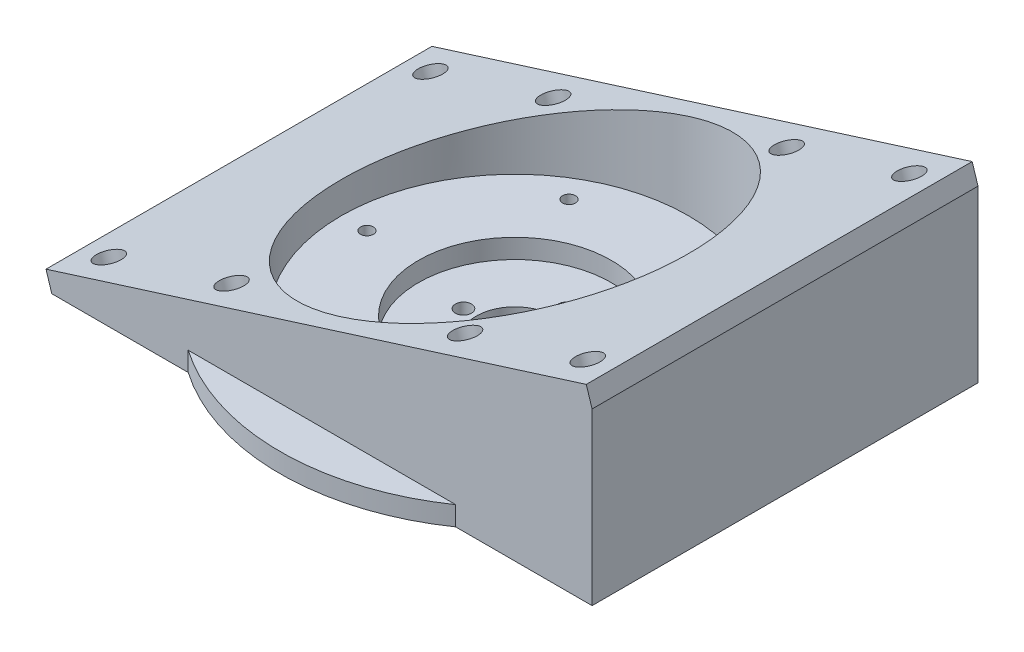
ISO-10303-21;
HEADER;
FILE_DESCRIPTION(('STEP AP214'),'2;1');
FILE_NAME('part.step','',(''),(''),'','','');
FILE_SCHEMA(('AUTOMOTIVE_DESIGN { 1 0 10303 214 1 1 1 1 }'));
ENDSEC;
DATA;
#1=APPLICATION_CONTEXT('core data for automotive mechanical design processes');
#2=APPLICATION_PROTOCOL_DEFINITION('international standard','automotive_design',2000,#1);
#3=PRODUCT_CONTEXT('',#1,'mechanical');
#4=PRODUCT('Part','Part','',(#3));
#5=PRODUCT_RELATED_PRODUCT_CATEGORY('part','',(#4));
#6=PRODUCT_DEFINITION_FORMATION('','',#4);
#7=PRODUCT_DEFINITION_CONTEXT('part definition',#1,'design');
#8=PRODUCT_DEFINITION('design','',#6,#7);
#9=PRODUCT_DEFINITION_SHAPE('','',#8);
#10=(LENGTH_UNIT() NAMED_UNIT(*) SI_UNIT(.MILLI.,.METRE.));
#11=(NAMED_UNIT(*) PLANE_ANGLE_UNIT() SI_UNIT($,.RADIAN.));
#12=(NAMED_UNIT(*) SI_UNIT($,.STERADIAN.) SOLID_ANGLE_UNIT());
#13=UNCERTAINTY_MEASURE_WITH_UNIT(LENGTH_MEASURE(1.E-05),#10,'distance_accuracy_value','');
#14=(GEOMETRIC_REPRESENTATION_CONTEXT(3) GLOBAL_UNCERTAINTY_ASSIGNED_CONTEXT((#13)) GLOBAL_UNIT_ASSIGNED_CONTEXT((#10,
#11,#12)) REPRESENTATION_CONTEXT('',''));
#15=CARTESIAN_POINT('',(0.,0.,0.));
#16=DIRECTION('',(0.,0.,1.));
#17=DIRECTION('',(1.,0.,0.));
#18=AXIS2_PLACEMENT_3D('',#15,#16,#17);
#19=CARTESIAN_POINT('',(-25.0823798627002,-10.9576659038902,30.));
#20=DIRECTION('',(0.,1.,0.));
#21=DIRECTION('',(0.,0.,1.));
#22=AXIS2_PLACEMENT_3D('',#19,#20,#21);
#23=CYLINDRICAL_SURFACE('',#22,6.);
#24=CARTESIAN_POINT('',(-25.0823798627002,-10.9576659038902,30.));
#25=DIRECTION('',(0.,1.,0.));
#26=DIRECTION('',(0.,0.,1.));
#27=AXIS2_PLACEMENT_3D('',#24,#25,#26);
#28=CIRCLE('',#27,6.);
#29=CARTESIAN_POINT('',(-25.0823798627002,-10.9576659038902,36.));
#30=VERTEX_POINT('',#29);
#31=EDGE_CURVE('E412',#30,#30,#28,.T.);
#32=ORIENTED_EDGE('',*,*,#31,.F.);
#33=EDGE_LOOP('',(#32));
#34=FACE_BOUND('',#33,.T.);
#35=CARTESIAN_POINT('',(-25.0823798627002,-7.95766590389017,30.));
#36=DIRECTION('',(0.,1.,0.));
#37=DIRECTION('',(0.,0.,1.));
#38=AXIS2_PLACEMENT_3D('',#35,#36,#37);
#39=CIRCLE('',#38,6.);
#40=CARTESIAN_POINT('',(-25.0823798627002,-7.95766590389017,36.));
#41=VERTEX_POINT('',#40);
#42=EDGE_CURVE('E43',#41,#41,#39,.F.);
#43=ORIENTED_EDGE('',*,*,#42,.F.);
#44=EDGE_LOOP('',(#43));
#45=FACE_BOUND('',#44,.T.);
#46=ADVANCED_FACE('F39',(#34,#45),#23,.F.);
#47=CARTESIAN_POINT('',(-25.0823798627002,42.0423340961098,30.));
#48=DIRECTION('',(0.,-1.,0.));
#49=DIRECTION('',(0.,0.,-1.));
#50=AXIS2_PLACEMENT_3D('',#47,#48,#49);
#51=CYLINDRICAL_SURFACE('',#50,27.);
#52=CARTESIAN_POINT('',(-25.0823798627002,8.4304706044496,30.));
#53=DIRECTION('',(-0.300705799504274,0.953716950748227,0.));
#54=DIRECTION('',(-0.953716950748227,-0.300705799504274,0.));
#55=AXIS2_PLACEMENT_3D('',#52,#53,#54);
#56=ELLIPSE('',#55,28.3102863788019,27.);
#57=CARTESIAN_POINT('',(-52.0823798627002,-0.0825966952829708,30.));
#58=VERTEX_POINT('',#57);
#59=EDGE_CURVE('E140',#58,#58,#56,.T.);
#60=ORIENTED_EDGE('',*,*,#59,.T.);
#61=EDGE_LOOP('',(#60));
#62=FACE_BOUND('',#61,.T.);
#63=CARTESIAN_POINT('',(-25.0823798627002,-4.95766590389017,30.));
#64=DIRECTION('',(0.,-1.,0.));
#65=DIRECTION('',(0.,0.,-1.));
#66=AXIS2_PLACEMENT_3D('',#63,#64,#65);
#67=CIRCLE('',#66,27.);
#68=CARTESIAN_POINT('',(-25.0823798627002,-4.95766590389017,3.));
#69=VERTEX_POINT('',#68);
#70=EDGE_CURVE('E174',#69,#69,#67,.F.);
#71=ORIENTED_EDGE('',*,*,#70,.F.);
#72=EDGE_LOOP('',(#71));
#73=FACE_BOUND('',#72,.T.);
#74=ADVANCED_FACE('F208',(#62,#73),#51,.F.);
#75=CARTESIAN_POINT('',(-67.0823798627002,-7.95766590389017,60.));
#76=DIRECTION('',(0.,1.,0.));
#77=DIRECTION('',(0.,0.,1.));
#78=AXIS2_PLACEMENT_3D('',#75,#76,#77);
#79=PLANE('',#78);
#80=CARTESIAN_POINT('',(-36.5823798627005,-7.95766590389017,10.081415712958));
#81=DIRECTION('',(0.,1.,0.));
#82=DIRECTION('',(0.,0.,1.));
#83=AXIS2_PLACEMENT_3D('',#80,#81,#82);
#84=CIRCLE('',#83,0.999999999999998);
#85=CARTESIAN_POINT('',(-36.5823798627005,-7.95766590389017,11.081415712958));
#86=VERTEX_POINT('',#85);
#87=EDGE_CURVE('E326',#86,#86,#84,.T.);
#88=ORIENTED_EDGE('',*,*,#87,.T.);
#89=EDGE_LOOP('',(#88));
#90=FACE_BOUND('',#89,.T.);
#91=CARTESIAN_POINT('',(-13.5823798627004,-7.95766590389017,10.0814157129578));
#92=DIRECTION('',(0.,1.,0.));
#93=DIRECTION('',(0.,0.,1.));
#94=AXIS2_PLACEMENT_3D('',#91,#92,#93);
#95=CIRCLE('',#94,0.999999999999998);
#96=CARTESIAN_POINT('',(-13.5823798627004,-7.95766590389017,11.0814157129578));
#97=VERTEX_POINT('',#96);
#98=EDGE_CURVE('E331',#97,#97,#95,.T.);
#99=ORIENTED_EDGE('',*,*,#98,.T.);
#100=EDGE_LOOP('',(#99));
#101=FACE_BOUND('',#100,.T.);
#102=CARTESIAN_POINT('',(-2.08237986270024,-7.95766590389017,30.));
#103=DIRECTION('',(0.,1.,0.));
#104=DIRECTION('',(0.,0.,1.));
#105=AXIS2_PLACEMENT_3D('',#102,#103,#104);
#106=CIRCLE('',#105,0.999999999999998);
#107=CARTESIAN_POINT('',(-2.08237986270024,-7.95766590389017,31.));
#108=VERTEX_POINT('',#107);
#109=EDGE_CURVE('E334',#108,#108,#106,.T.);
#110=ORIENTED_EDGE('',*,*,#109,.T.);
#111=EDGE_LOOP('',(#110));
#112=FACE_BOUND('',#111,.T.);
#113=CARTESIAN_POINT('',(-13.5823798627001,-7.95766590389017,49.918584287042));
#114=DIRECTION('',(0.,1.,0.));
#115=DIRECTION('',(0.,0.,1.));
#116=AXIS2_PLACEMENT_3D('',#113,#114,#115);
#117=CIRCLE('',#116,0.999999999999998);
#118=CARTESIAN_POINT('',(-13.5823798627001,-7.95766590389017,50.918584287042));
#119=VERTEX_POINT('',#118);
#120=EDGE_CURVE('E337',#119,#119,#117,.T.);
#121=ORIENTED_EDGE('',*,*,#120,.T.);
#122=EDGE_LOOP('',(#121));
#123=FACE_BOUND('',#122,.T.);
#124=CARTESIAN_POINT('',(-36.5823798627002,-7.95766590389017,49.9185842870421));
#125=DIRECTION('',(0.,1.,0.));
#126=DIRECTION('',(0.,0.,1.));
#127=AXIS2_PLACEMENT_3D('',#124,#125,#126);
#128=CIRCLE('',#127,0.999999999999998);
#129=CARTESIAN_POINT('',(-36.5823798627002,-7.95766590389017,50.9185842870421));
#130=VERTEX_POINT('',#129);
#131=EDGE_CURVE('E340',#130,#130,#128,.T.);
#132=ORIENTED_EDGE('',*,*,#131,.T.);
#133=EDGE_LOOP('',(#132));
#134=FACE_BOUND('',#133,.T.);
#135=CARTESIAN_POINT('',(-48.0823798627002,-7.95766590389017,30.));
#136=DIRECTION('',(0.,1.,0.));
#137=DIRECTION('',(0.,0.,1.));
#138=AXIS2_PLACEMENT_3D('',#135,#136,#137);
#139=CIRCLE('',#138,0.999999999999998);
#140=CARTESIAN_POINT('',(-48.0823798627002,-7.95766590389017,31.));
#141=VERTEX_POINT('',#140);
#142=EDGE_CURVE('E133',#141,#141,#139,.T.);
#143=ORIENTED_EDGE('',*,*,#142,.T.);
#144=EDGE_LOOP('',(#143));
#145=FACE_BOUND('',#144,.T.);
#146=CARTESIAN_POINT('',(-25.0823798627002,-7.95766590389017,30.));
#147=DIRECTION('',(0.,1.,0.));
#148=DIRECTION('',(0.,0.,1.));
#149=AXIS2_PLACEMENT_3D('',#146,#147,#148);
#150=CIRCLE('',#149,20.);
#151=CARTESIAN_POINT('',(-25.0823798627002,-7.95766590389017,50.));
#152=VERTEX_POINT('',#151);
#153=EDGE_CURVE('E399',#152,#152,#150,.T.);
#154=ORIENTED_EDGE('',*,*,#153,.T.);
#155=EDGE_LOOP('',(#154));
#156=FACE_BOUND('',#155,.T.);
#157=DIRECTION('',(1.,0.,0.));
#158=VECTOR('',#157,1.);
#159=CARTESIAN_POINT('',(-67.0823798627002,-7.95766590389017,0.));
#160=LINE('',#159,#158);
#161=CARTESIAN_POINT('',(-67.0823798627002,-7.95766590389017,0.));
#162=VERTEX_POINT('',#161);
#163=CARTESIAN_POINT('',(-45.873002748992,-7.95766590389017,0.));
#164=VERTEX_POINT('',#163);
#165=EDGE_CURVE('E166',#162,#164,#160,.T.);
#166=ORIENTED_EDGE('',*,*,#165,.T.);
#167=CARTESIAN_POINT('',(-25.0823798627002,-7.95766590389017,30.));
#168=DIRECTION('',(0.,-1.,0.));
#169=DIRECTION('',(0.,0.,-1.));
#170=AXIS2_PLACEMENT_3D('',#167,#168,#169);
#171=CIRCLE('',#170,36.5);
#172=CARTESIAN_POINT('',(-4.29175697640848,-7.95766590389017,0.));
#173=VERTEX_POINT('',#172);
#174=EDGE_CURVE('E128',#164,#173,#171,.T.);
#175=ORIENTED_EDGE('',*,*,#174,.T.);
#176=CARTESIAN_POINT('',(16.9176201372998,-7.95766590389017,0.));
#177=VERTEX_POINT('',#176);
#178=EDGE_CURVE('E161',#173,#177,#160,.T.);
#179=ORIENTED_EDGE('',*,*,#178,.T.);
#180=DIRECTION('',(0.,0.,-1.));
#181=VECTOR('',#180,1.);
#182=CARTESIAN_POINT('',(16.9176201372998,-7.95766590389017,60.));
#183=LINE('',#182,#181);
#184=CARTESIAN_POINT('',(16.9176201372998,-7.95766590389017,60.));
#185=VERTEX_POINT('',#184);
#186=EDGE_CURVE('E115',#185,#177,#183,.T.);
#187=ORIENTED_EDGE('',*,*,#186,.F.);
#188=DIRECTION('',(1.,0.,0.));
#189=VECTOR('',#188,1.);
#190=CARTESIAN_POINT('',(-67.0823798627002,-7.95766590389017,60.));
#191=LINE('',#190,#189);
#192=CARTESIAN_POINT('',(-4.29175697640845,-7.95766590389017,60.));
#193=VERTEX_POINT('',#192);
#194=EDGE_CURVE('E110',#193,#185,#191,.T.);
#195=ORIENTED_EDGE('',*,*,#194,.F.);
#196=CARTESIAN_POINT('',(-45.873002748992,-7.95766590389017,60.));
#197=VERTEX_POINT('',#196);
#198=EDGE_CURVE('E113',#193,#197,#171,.T.);
#199=ORIENTED_EDGE('',*,*,#198,.T.);
#200=CARTESIAN_POINT('',(-67.0823798627002,-7.95766590389017,60.));
#201=VERTEX_POINT('',#200);
#202=EDGE_CURVE('E117',#201,#197,#191,.T.);
#203=ORIENTED_EDGE('',*,*,#202,.F.);
#204=DIRECTION('',(0.,0.,-1.));
#205=VECTOR('',#204,1.);
#206=CARTESIAN_POINT('',(-67.0823798627002,-7.95766590389017,60.));
#207=LINE('',#206,#205);
#208=EDGE_CURVE('E172',#201,#162,#207,.T.);
#209=ORIENTED_EDGE('',*,*,#208,.T.);
#210=EDGE_LOOP('',(#166,#175,#179,#187,#195,#199,#203,#209));
#211=FACE_BOUND('',#210,.T.);
#212=ADVANCED_FACE('F41',(#90,#101,#112,#123,#134,#145,#156,#211),#79,.F.);
#213=CARTESIAN_POINT('',(16.9176201372998,-7.95766590389017,60.));
#214=DIRECTION('',(-1.,0.,0.));
#215=DIRECTION('',(0.,0.,1.));
#216=AXIS2_PLACEMENT_3D('',#213,#214,#215);
#217=PLANE('',#216);
#218=DIRECTION('',(0.,1.,0.));
#219=VECTOR('',#218,1.);
#220=CARTESIAN_POINT('',(16.9176201372998,-7.95766590389017,0.));
#221=LINE('',#220,#219);
#222=CARTESIAN_POINT('',(16.9176201372998,18.5274323619445,0.));
#223=VERTEX_POINT('',#222);
#224=EDGE_CURVE('E118',#177,#223,#221,.T.);
#225=ORIENTED_EDGE('',*,*,#224,.T.);
#226=DIRECTION('',(0.,0.,-1.));
#227=VECTOR('',#226,1.);
#228=CARTESIAN_POINT('',(16.9176201372998,18.5274323619445,60.));
#229=LINE('',#228,#227);
#230=CARTESIAN_POINT('',(16.9176201372998,18.5274323619445,60.));
#231=VERTEX_POINT('',#230);
#232=EDGE_CURVE('E165',#231,#223,#229,.T.);
#233=ORIENTED_EDGE('',*,*,#232,.F.);
#234=DIRECTION('',(0.,1.,0.));
#235=VECTOR('',#234,1.);
#236=CARTESIAN_POINT('',(16.9176201372998,-7.95766590389017,60.));
#237=LINE('',#236,#235);
#238=EDGE_CURVE('E163',#185,#231,#237,.T.);
#239=ORIENTED_EDGE('',*,*,#238,.F.);
#240=ORIENTED_EDGE('',*,*,#186,.T.);
#241=EDGE_LOOP('',(#225,#233,#239,#240));
#242=FACE_BOUND('',#241,.T.);
#243=ADVANCED_FACE('F488',(#242),#217,.F.);
#244=CARTESIAN_POINT('',(0.,0.,60.));
#245=DIRECTION('',(0.,0.,1.));
#246=DIRECTION('',(1.,0.,0.));
#247=AXIS2_PLACEMENT_3D('',#244,#245,#246);
#248=PLANE('',#247);
#249=DIRECTION('',(0.,-1.,0.));
#250=VECTOR('',#249,1.);
#251=CARTESIAN_POINT('',(-45.873002748992,-4.95766590389017,60.));
#252=LINE('',#251,#250);
#253=CARTESIAN_POINT('',(-45.873002748992,-4.95766590389017,60.));
#254=VERTEX_POINT('',#253);
#255=EDGE_CURVE('E60',#254,#197,#252,.T.);
#256=ORIENTED_EDGE('',*,*,#255,.F.);
#257=DIRECTION('',(1.,0.,0.));
#258=VECTOR('',#257,1.);
#259=CARTESIAN_POINT('',(0.,-4.95766590389017,60.));
#260=LINE('',#259,#258);
#261=CARTESIAN_POINT('',(-4.29175697640845,-4.95766590389017,60.));
#262=VERTEX_POINT('',#261);
#263=EDGE_CURVE('E55',#254,#262,#260,.T.);
#264=ORIENTED_EDGE('',*,*,#263,.T.);
#265=DIRECTION('',(0.,-1.,0.));
#266=VECTOR('',#265,1.);
#267=CARTESIAN_POINT('',(-4.29175697640845,-4.95766590389017,60.));
#268=LINE('',#267,#266);
#269=EDGE_CURVE('E120',#193,#262,#268,.F.);
#270=ORIENTED_EDGE('',*,*,#269,.F.);
#271=ORIENTED_EDGE('',*,*,#194,.T.);
#272=ORIENTED_EDGE('',*,*,#238,.T.);
#273=DIRECTION('',(0.300705799504274,-0.953716950748227,0.));
#274=VECTOR('',#273,1.);
#275=CARTESIAN_POINT('',(16.0155027387869,21.3885832141892,60.));
#276=LINE('',#275,#274);
#277=CARTESIAN_POINT('',(16.0155027387869,21.3885832141892,60.));
#278=VERTEX_POINT('',#277);
#279=EDGE_CURVE('E156',#278,#231,#276,.T.);
#280=ORIENTED_EDGE('',*,*,#279,.F.);
#281=DIRECTION('',(0.953716950748227,0.300705799504274,0.));
#282=VECTOR('',#281,1.);
#283=CARTESIAN_POINT('',(-67.9844972612131,-5.09651505164549,60.));
#284=LINE('',#283,#282);
#285=CARTESIAN_POINT('',(-67.9844972612131,-5.09651505164549,60.));
#286=VERTEX_POINT('',#285);
#287=EDGE_CURVE('E144',#286,#278,#284,.T.);
#288=ORIENTED_EDGE('',*,*,#287,.F.);
#289=DIRECTION('',(0.300705799504274,-0.953716950748227,0.));
#290=VECTOR('',#289,1.);
#291=CARTESIAN_POINT('',(-67.9844972612131,-5.09651505164549,60.));
#292=LINE('',#291,#290);
#293=EDGE_CURVE('E159',#286,#201,#292,.T.);
#294=ORIENTED_EDGE('',*,*,#293,.T.);
#295=ORIENTED_EDGE('',*,*,#202,.T.);
#296=EDGE_LOOP('',(#256,#264,#270,#271,#272,#280,#288,#294,#295));
#297=FACE_BOUND('',#296,.T.);
#298=ADVANCED_FACE('F121',(#297),#248,.T.);
#299=CARTESIAN_POINT('',(0.,0.,0.));
#300=DIRECTION('',(0.,0.,1.));
#301=DIRECTION('',(1.,0.,0.));
#302=AXIS2_PLACEMENT_3D('',#299,#300,#301);
#303=PLANE('',#302);
#304=DIRECTION('',(1.,0.,0.));
#305=VECTOR('',#304,1.);
#306=CARTESIAN_POINT('',(0.,-4.95766590389017,0.));
#307=LINE('',#306,#305);
#308=CARTESIAN_POINT('',(-45.873002748992,-4.95766590389017,0.));
#309=VERTEX_POINT('',#308);
#310=CARTESIAN_POINT('',(-4.29175697640845,-4.95766590389017,0.));
#311=VERTEX_POINT('',#310);
#312=EDGE_CURVE('E136',#309,#311,#307,.T.);
#313=ORIENTED_EDGE('',*,*,#312,.F.);
#314=DIRECTION('',(0.,-1.,0.));
#315=VECTOR('',#314,1.);
#316=CARTESIAN_POINT('',(-45.873002748992,-4.95766590389017,0.));
#317=LINE('',#316,#315);
#318=EDGE_CURVE('E11',#309,#164,#317,.T.);
#319=ORIENTED_EDGE('',*,*,#318,.T.);
#320=ORIENTED_EDGE('',*,*,#165,.F.);
#321=DIRECTION('',(0.300705799504274,-0.953716950748227,0.));
#322=VECTOR('',#321,1.);
#323=CARTESIAN_POINT('',(-67.9844972612131,-5.09651505164549,0.));
#324=LINE('',#323,#322);
#325=CARTESIAN_POINT('',(-67.9844972612131,-5.09651505164549,0.));
#326=VERTEX_POINT('',#325);
#327=EDGE_CURVE('E150',#326,#162,#324,.T.);
#328=ORIENTED_EDGE('',*,*,#327,.F.);
#329=DIRECTION('',(-0.953716950748227,-0.300705799504274,0.));
#330=VECTOR('',#329,1.);
#331=CARTESIAN_POINT('',(-67.9844972612131,-5.09651505164549,0.));
#332=LINE('',#331,#330);
#333=CARTESIAN_POINT('',(16.0155027387869,21.3885832141892,0.));
#334=VERTEX_POINT('',#333);
#335=EDGE_CURVE('E148',#334,#326,#332,.T.);
#336=ORIENTED_EDGE('',*,*,#335,.F.);
#337=DIRECTION('',(0.300705799504274,-0.953716950748227,0.));
#338=VECTOR('',#337,1.);
#339=CARTESIAN_POINT('',(16.0155027387869,21.3885832141892,0.));
#340=LINE('',#339,#338);
#341=EDGE_CURVE('E153',#334,#223,#340,.T.);
#342=ORIENTED_EDGE('',*,*,#341,.T.);
#343=ORIENTED_EDGE('',*,*,#224,.F.);
#344=ORIENTED_EDGE('',*,*,#178,.F.);
#345=DIRECTION('',(0.,-1.,0.));
#346=VECTOR('',#345,1.);
#347=CARTESIAN_POINT('',(-4.29175697640845,-4.95766590389017,0.));
#348=LINE('',#347,#346);
#349=EDGE_CURVE('E48',#173,#311,#348,.F.);
#350=ORIENTED_EDGE('',*,*,#349,.T.);
#351=EDGE_LOOP('',(#313,#319,#320,#328,#336,#342,#343,#344,#350));
#352=FACE_BOUND('',#351,.T.);
#353=ADVANCED_FACE('F184',(#352),#303,.F.);
#354=CARTESIAN_POINT('',(-67.9844972612131,-5.09651505164549,0.));
#355=DIRECTION('',(0.953716950748227,0.300705799504274,0.));
#356=DIRECTION('',(-0.300705799504274,0.953716950748227,0.));
#357=AXIS2_PLACEMENT_3D('',#354,#355,#356);
#358=PLANE('',#357);
#359=ORIENTED_EDGE('',*,*,#208,.F.);
#360=ORIENTED_EDGE('',*,*,#293,.F.);
#361=DIRECTION('',(0.,0.,1.));
#362=VECTOR('',#361,1.);
#363=CARTESIAN_POINT('',(-67.9844972612131,-5.09651505164549,0.));
#364=LINE('',#363,#362);
#365=EDGE_CURVE('E141',#326,#286,#364,.T.);
#366=ORIENTED_EDGE('',*,*,#365,.F.);
#367=ORIENTED_EDGE('',*,*,#327,.T.);
#368=EDGE_LOOP('',(#359,#360,#366,#367));
#369=FACE_BOUND('',#368,.T.);
#370=ADVANCED_FACE('F514',(#369),#358,.F.);
#371=CARTESIAN_POINT('',(16.0155027387869,21.3885832141892,0.));
#372=DIRECTION('',(-0.953716950748227,-0.300705799504274,0.));
#373=DIRECTION('',(0.300705799504274,-0.953716950748227,0.));
#374=AXIS2_PLACEMENT_3D('',#371,#372,#373);
#375=PLANE('',#374);
#376=ORIENTED_EDGE('',*,*,#232,.T.);
#377=ORIENTED_EDGE('',*,*,#341,.F.);
#378=DIRECTION('',(0.,0.,-1.));
#379=VECTOR('',#378,1.);
#380=CARTESIAN_POINT('',(16.0155027387869,21.3885832141892,0.));
#381=LINE('',#380,#379);
#382=EDGE_CURVE('E146',#278,#334,#381,.T.);
#383=ORIENTED_EDGE('',*,*,#382,.F.);
#384=ORIENTED_EDGE('',*,*,#279,.T.);
#385=EDGE_LOOP('',(#376,#377,#383,#384));
#386=FACE_BOUND('',#385,.T.);
#387=ADVANCED_FACE('F517',(#386),#375,.F.);
#388=CARTESIAN_POINT('',(-4.68580820429939,14.8614849456268,0.));
#389=DIRECTION('',(-0.300705799504274,0.953716950748227,0.));
#390=DIRECTION('',(-0.953716950748227,-0.300705799504274,0.));
#391=AXIS2_PLACEMENT_3D('',#388,#389,#390);
#392=PLANE('',#391);
#393=CARTESIAN_POINT('',(-7.82742102991873,13.8709382265823,55.));
#394=DIRECTION('',(-0.300705799504274,0.953716950748227,0.));
#395=DIRECTION('',(-0.953716950748227,-0.300705799504274,0.));
#396=AXIS2_PLACEMENT_3D('',#393,#394,#395);
#397=CIRCLE('',#396,2.);
#398=CARTESIAN_POINT('',(-9.73485493141519,13.2695266275738,55.));
#399=VERTEX_POINT('',#398);
#400=EDGE_CURVE('E402',#399,#399,#397,.T.);
#401=ORIENTED_EDGE('',*,*,#400,.F.);
#402=EDGE_LOOP('',(#401));
#403=FACE_BOUND('',#402,.T.);
#404=CARTESIAN_POINT('',(-7.82742102991873,13.8709382265823,5.));
#405=DIRECTION('',(-0.300705799504274,0.953716950748227,0.));
#406=DIRECTION('',(-0.953716950748227,-0.300705799504274,0.));
#407=AXIS2_PLACEMENT_3D('',#404,#405,#406);
#408=CIRCLE('',#407,2.);
#409=CARTESIAN_POINT('',(-9.73485493141518,13.2695266275738,5.));
#410=VERTEX_POINT('',#409);
#411=EDGE_CURVE('E395',#410,#410,#408,.T.);
#412=ORIENTED_EDGE('',*,*,#411,.F.);
#413=EDGE_LOOP('',(#412));
#414=FACE_BOUND('',#413,.T.);
#415=CARTESIAN_POINT('',(11.2469179850458,19.8850542166678,55.));
#416=DIRECTION('',(-0.300705799504274,0.953716950748227,0.));
#417=DIRECTION('',(-0.953716950748227,-0.300705799504274,0.));
#418=AXIS2_PLACEMENT_3D('',#415,#416,#417);
#419=CIRCLE('',#418,2.);
#420=CARTESIAN_POINT('',(9.33948408354935,19.2836426176593,55.));
#421=VERTEX_POINT('',#420);
#422=EDGE_CURVE('E390',#421,#421,#419,.T.);
#423=ORIENTED_EDGE('',*,*,#422,.F.);
#424=EDGE_LOOP('',(#423));
#425=FACE_BOUND('',#424,.T.);
#426=CARTESIAN_POINT('',(11.2469179850458,19.8850542166678,5.));
#427=DIRECTION('',(-0.300705799504274,0.953716950748227,0.));
#428=DIRECTION('',(-0.953716950748227,-0.300705799504274,0.));
#429=AXIS2_PLACEMENT_3D('',#426,#427,#428);
#430=CIRCLE('',#429,2.);
#431=CARTESIAN_POINT('',(9.33948408354935,19.2836426176593,5.));
#432=VERTEX_POINT('',#431);
#433=EDGE_CURVE('E386',#432,#432,#430,.T.);
#434=ORIENTED_EDGE('',*,*,#433,.F.);
#435=EDGE_LOOP('',(#434));
#436=FACE_BOUND('',#435,.T.);
#437=CARTESIAN_POINT('',(-44.1415734925074,2.42112993596135,5.));
#438=DIRECTION('',(-0.300705799504274,0.953716950748227,0.));
#439=DIRECTION('',(-0.953716950748227,-0.300705799504274,0.));
#440=AXIS2_PLACEMENT_3D('',#437,#438,#439);
#441=CIRCLE('',#440,2.);
#442=CARTESIAN_POINT('',(-46.0490073940038,1.81971833695281,5.));
#443=VERTEX_POINT('',#442);
#444=EDGE_CURVE('E378',#443,#443,#441,.T.);
#445=ORIENTED_EDGE('',*,*,#444,.F.);
#446=EDGE_LOOP('',(#445));
#447=FACE_BOUND('',#446,.T.);
#448=CARTESIAN_POINT('',(-44.1415734925074,2.42112993596135,55.));
#449=DIRECTION('',(-0.300705799504274,0.953716950748227,0.));
#450=DIRECTION('',(-0.953716950748227,-0.300705799504274,0.));
#451=AXIS2_PLACEMENT_3D('',#448,#449,#450);
#452=CIRCLE('',#451,2.);
#453=CARTESIAN_POINT('',(-46.0490073940039,1.81971833695281,55.));
#454=VERTEX_POINT('',#453);
#455=EDGE_CURVE('E371',#454,#454,#452,.T.);
#456=ORIENTED_EDGE('',*,*,#455,.F.);
#457=EDGE_LOOP('',(#456));
#458=FACE_BOUND('',#457,.T.);
#459=CARTESIAN_POINT('',(-63.2159125074719,-3.59298605412412,5.));
#460=DIRECTION('',(-0.300705799504274,0.953716950748227,0.));
#461=DIRECTION('',(-0.953716950748227,-0.300705799504274,0.));
#462=AXIS2_PLACEMENT_3D('',#459,#460,#461);
#463=CIRCLE('',#462,2.);
#464=CARTESIAN_POINT('',(-65.1233464089684,-4.19439765313267,5.));
#465=VERTEX_POINT('',#464);
#466=EDGE_CURVE('E366',#465,#465,#463,.T.);
#467=ORIENTED_EDGE('',*,*,#466,.F.);
#468=EDGE_LOOP('',(#467));
#469=FACE_BOUND('',#468,.T.);
#470=CARTESIAN_POINT('',(-63.2159125074719,-3.59298605412412,55.));
#471=DIRECTION('',(-0.300705799504274,0.953716950748227,0.));
#472=DIRECTION('',(-0.953716950748227,-0.300705799504274,0.));
#473=AXIS2_PLACEMENT_3D('',#470,#471,#472);
#474=CIRCLE('',#473,2.);
#475=CARTESIAN_POINT('',(-65.1233464089684,-4.19439765313267,55.));
#476=VERTEX_POINT('',#475);
#477=EDGE_CURVE('E362',#476,#476,#474,.T.);
#478=ORIENTED_EDGE('',*,*,#477,.F.);
#479=EDGE_LOOP('',(#478));
#480=FACE_BOUND('',#479,.T.);
#481=ORIENTED_EDGE('',*,*,#59,.F.);
#482=EDGE_LOOP('',(#481));
#483=FACE_BOUND('',#482,.T.);
#484=ORIENTED_EDGE('',*,*,#365,.T.);
#485=ORIENTED_EDGE('',*,*,#287,.T.);
#486=ORIENTED_EDGE('',*,*,#382,.T.);
#487=ORIENTED_EDGE('',*,*,#335,.T.);
#488=EDGE_LOOP('',(#484,#485,#486,#487));
#489=FACE_BOUND('',#488,.T.);
#490=ADVANCED_FACE('F201',(#403,#414,#425,#436,#447,#458,#469,#480,#483,#489),#392,.T.);
#491=CARTESIAN_POINT('',(-25.0823798627002,-4.95766590389017,30.));
#492=DIRECTION('',(0.,-1.,0.));
#493=DIRECTION('',(0.,0.,-1.));
#494=AXIS2_PLACEMENT_3D('',#491,#492,#493);
#495=PLANE('',#494);
#496=CARTESIAN_POINT('',(-25.0823798627002,-4.95766590389017,30.));
#497=DIRECTION('',(0.,1.,0.));
#498=DIRECTION('',(0.,0.,1.));
#499=AXIS2_PLACEMENT_3D('',#496,#497,#498);
#500=CIRCLE('',#499,15.);
#501=CARTESIAN_POINT('',(-25.0823798627002,-4.95766590389017,45.));
#502=VERTEX_POINT('',#501);
#503=EDGE_CURVE('E415',#502,#502,#500,.T.);
#504=ORIENTED_EDGE('',*,*,#503,.F.);
#505=EDGE_LOOP('',(#504));
#506=FACE_BOUND('',#505,.T.);
#507=CARTESIAN_POINT('',(-36.5823798627005,-4.95766590389017,10.081415712958));
#508=DIRECTION('',(0.,1.,0.));
#509=DIRECTION('',(-0.866025403784433,0.,0.50000000000001));
#510=AXIS2_PLACEMENT_3D('',#507,#508,#509);
#511=CIRCLE('',#510,0.999999999999998);
#512=CARTESIAN_POINT('',(-37.4484052664849,-4.95766590389017,10.5814157129581));
#513=VERTEX_POINT('',#512);
#514=EDGE_CURVE('E347',#513,#513,#511,.T.);
#515=ORIENTED_EDGE('',*,*,#514,.F.);
#516=EDGE_LOOP('',(#515));
#517=FACE_BOUND('',#516,.T.);
#518=CARTESIAN_POINT('',(-13.5823798627004,-4.95766590389017,10.0814157129578));
#519=DIRECTION('',(0.,1.,0.));
#520=DIRECTION('',(-0.866025403784443,0.,-0.499999999999992));
#521=AXIS2_PLACEMENT_3D('',#518,#519,#520);
#522=CIRCLE('',#521,0.999999999999998);
#523=CARTESIAN_POINT('',(-14.4484052664849,-4.95766590389017,9.58141571295782));
#524=VERTEX_POINT('',#523);
#525=EDGE_CURVE('E350',#524,#524,#522,.T.);
#526=ORIENTED_EDGE('',*,*,#525,.F.);
#527=EDGE_LOOP('',(#526));
#528=FACE_BOUND('',#527,.T.);
#529=CARTESIAN_POINT('',(-2.08237986270024,-4.95766590389017,30.));
#530=DIRECTION('',(0.,1.,0.));
#531=DIRECTION('',(0.,0.,-1.));
#532=AXIS2_PLACEMENT_3D('',#529,#530,#531);
#533=CIRCLE('',#532,0.999999999999998);
#534=CARTESIAN_POINT('',(-2.08237986270024,-4.95766590389017,29.));
#535=VERTEX_POINT('',#534);
#536=EDGE_CURVE('E354',#535,#535,#533,.T.);
#537=ORIENTED_EDGE('',*,*,#536,.F.);
#538=EDGE_LOOP('',(#537));
#539=FACE_BOUND('',#538,.T.);
#540=CARTESIAN_POINT('',(-13.5823798627001,-4.95766590389017,49.918584287042));
#541=DIRECTION('',(0.,1.,0.));
#542=DIRECTION('',(0.866025403784436,0.,-0.500000000000004));
#543=AXIS2_PLACEMENT_3D('',#540,#541,#542);
#544=CIRCLE('',#543,0.999999999999998);
#545=CARTESIAN_POINT('',(-12.7163544589157,-4.95766590389017,49.418584287042));
#546=VERTEX_POINT('',#545);
#547=EDGE_CURVE('E346',#546,#546,#544,.T.);
#548=ORIENTED_EDGE('',*,*,#547,.F.);
#549=EDGE_LOOP('',(#548));
#550=FACE_BOUND('',#549,.T.);
#551=CARTESIAN_POINT('',(-36.5823798627002,-4.95766590389017,49.9185842870421));
#552=DIRECTION('',(0.,1.,0.));
#553=DIRECTION('',(0.86602540378444,0.,0.499999999999998));
#554=AXIS2_PLACEMENT_3D('',#551,#552,#553);
#555=CIRCLE('',#554,0.999999999999998);
#556=CARTESIAN_POINT('',(-35.7163544589158,-4.95766590389017,50.4185842870421));
#557=VERTEX_POINT('',#556);
#558=EDGE_CURVE('E343',#557,#557,#555,.T.);
#559=ORIENTED_EDGE('',*,*,#558,.F.);
#560=EDGE_LOOP('',(#559));
#561=FACE_BOUND('',#560,.T.);
#562=CARTESIAN_POINT('',(-48.0823798627002,-4.95766590389017,30.));
#563=DIRECTION('',(0.,1.,0.));
#564=DIRECTION('',(0.,0.,1.));
#565=AXIS2_PLACEMENT_3D('',#562,#563,#564);
#566=CIRCLE('',#565,0.999999999999998);
#567=CARTESIAN_POINT('',(-48.0823798627002,-4.95766590389017,31.));
#568=VERTEX_POINT('',#567);
#569=EDGE_CURVE('E322',#568,#568,#566,.T.);
#570=ORIENTED_EDGE('',*,*,#569,.F.);
#571=EDGE_LOOP('',(#570));
#572=FACE_BOUND('',#571,.T.);
#573=ORIENTED_EDGE('',*,*,#70,.T.);
#574=EDGE_LOOP('',(#573));
#575=FACE_BOUND('',#574,.T.);
#576=ADVANCED_FACE('F192',(#506,#517,#528,#539,#550,#561,#572,#575),#495,.F.);
#577=CARTESIAN_POINT('',(-25.0823798627002,-4.95766590389017,30.));
#578=DIRECTION('',(0.,-1.,0.));
#579=DIRECTION('',(0.,0.,-1.));
#580=AXIS2_PLACEMENT_3D('',#577,#578,#579);
#581=CIRCLE('',#580,36.5);
#582=EDGE_CURVE('E127',#309,#311,#581,.T.);
#583=ORIENTED_EDGE('',*,*,#582,.F.);
#584=ORIENTED_EDGE('',*,*,#312,.T.);
#585=EDGE_LOOP('',(#583,#584));
#586=FACE_BOUND('',#585,.T.);
#587=ADVANCED_FACE('F190',(#586),#495,.F.);
#588=CARTESIAN_POINT('',(-25.0823798627002,-4.95766590389017,30.));
#589=DIRECTION('',(0.,-1.,0.));
#590=DIRECTION('',(0.,0.,-1.));
#591=AXIS2_PLACEMENT_3D('',#588,#589,#590);
#592=CYLINDRICAL_SURFACE('',#591,36.5);
#593=ORIENTED_EDGE('',*,*,#318,.F.);
#594=ORIENTED_EDGE('',*,*,#582,.T.);
#595=ORIENTED_EDGE('',*,*,#349,.F.);
#596=ORIENTED_EDGE('',*,*,#174,.F.);
#597=EDGE_LOOP('',(#593,#594,#595,#596));
#598=FACE_BOUND('',#597,.T.);
#599=ADVANCED_FACE('F187',(#598),#592,.T.);
#600=EDGE_CURVE('E131',#262,#254,#581,.T.);
#601=ORIENTED_EDGE('',*,*,#600,.T.);
#602=ORIENTED_EDGE('',*,*,#255,.T.);
#603=ORIENTED_EDGE('',*,*,#198,.F.);
#604=ORIENTED_EDGE('',*,*,#269,.T.);
#605=EDGE_LOOP('',(#601,#602,#603,#604));
#606=FACE_BOUND('',#605,.T.);
#607=ADVANCED_FACE('F126',(#606),#592,.T.);
#608=ORIENTED_EDGE('',*,*,#263,.F.);
#609=ORIENTED_EDGE('',*,*,#600,.F.);
#610=EDGE_LOOP('',(#608,#609));
#611=FACE_BOUND('',#610,.T.);
#612=ADVANCED_FACE('F194',(#611),#495,.F.);
#613=CARTESIAN_POINT('',(-48.0823798627002,-64.9576659038902,30.));
#614=DIRECTION('',(0.,1.,0.));
#615=DIRECTION('',(0.,0.,1.));
#616=AXIS2_PLACEMENT_3D('',#613,#614,#615);
#617=CYLINDRICAL_SURFACE('',#616,0.999999999999998);
#618=ORIENTED_EDGE('',*,*,#569,.T.);
#619=EDGE_LOOP('',(#618));
#620=FACE_BOUND('',#619,.T.);
#621=ORIENTED_EDGE('',*,*,#142,.F.);
#622=EDGE_LOOP('',(#621));
#623=FACE_BOUND('',#622,.T.);
#624=ADVANCED_FACE('F205',(#620,#623),#617,.F.);
#625=CARTESIAN_POINT('',(-36.5823798627002,-64.9576659038902,49.9185842870421));
#626=DIRECTION('',(0.,1.,0.));
#627=DIRECTION('',(0.,0.,1.));
#628=AXIS2_PLACEMENT_3D('',#625,#626,#627);
#629=CYLINDRICAL_SURFACE('',#628,0.999999999999998);
#630=ORIENTED_EDGE('',*,*,#558,.T.);
#631=EDGE_LOOP('',(#630));
#632=FACE_BOUND('',#631,.T.);
#633=ORIENTED_EDGE('',*,*,#131,.F.);
#634=EDGE_LOOP('',(#633));
#635=FACE_BOUND('',#634,.T.);
#636=ADVANCED_FACE('F300',(#632,#635),#629,.F.);
#637=CARTESIAN_POINT('',(-13.5823798627001,-64.9576659038902,49.918584287042));
#638=DIRECTION('',(0.,1.,0.));
#639=DIRECTION('',(0.,0.,1.));
#640=AXIS2_PLACEMENT_3D('',#637,#638,#639);
#641=CYLINDRICAL_SURFACE('',#640,0.999999999999998);
#642=ORIENTED_EDGE('',*,*,#547,.T.);
#643=EDGE_LOOP('',(#642));
#644=FACE_BOUND('',#643,.T.);
#645=ORIENTED_EDGE('',*,*,#120,.F.);
#646=EDGE_LOOP('',(#645));
#647=FACE_BOUND('',#646,.T.);
#648=ADVANCED_FACE('F296',(#644,#647),#641,.F.);
#649=CARTESIAN_POINT('',(-2.08237986270024,-64.9576659038902,30.));
#650=DIRECTION('',(0.,1.,0.));
#651=DIRECTION('',(0.,0.,1.));
#652=AXIS2_PLACEMENT_3D('',#649,#650,#651);
#653=CYLINDRICAL_SURFACE('',#652,0.999999999999998);
#654=ORIENTED_EDGE('',*,*,#536,.T.);
#655=EDGE_LOOP('',(#654));
#656=FACE_BOUND('',#655,.T.);
#657=ORIENTED_EDGE('',*,*,#109,.F.);
#658=EDGE_LOOP('',(#657));
#659=FACE_BOUND('',#658,.T.);
#660=ADVANCED_FACE('F299',(#656,#659),#653,.F.);
#661=CARTESIAN_POINT('',(-13.5823798627004,-64.9576659038902,10.0814157129578));
#662=DIRECTION('',(0.,1.,0.));
#663=DIRECTION('',(0.,0.,1.));
#664=AXIS2_PLACEMENT_3D('',#661,#662,#663);
#665=CYLINDRICAL_SURFACE('',#664,0.999999999999998);
#666=ORIENTED_EDGE('',*,*,#525,.T.);
#667=EDGE_LOOP('',(#666));
#668=FACE_BOUND('',#667,.T.);
#669=ORIENTED_EDGE('',*,*,#98,.F.);
#670=EDGE_LOOP('',(#669));
#671=FACE_BOUND('',#670,.T.);
#672=ADVANCED_FACE('F304',(#668,#671),#665,.F.);
#673=CARTESIAN_POINT('',(-36.5823798627005,-64.9576659038902,10.081415712958));
#674=DIRECTION('',(0.,1.,0.));
#675=DIRECTION('',(0.,0.,1.));
#676=AXIS2_PLACEMENT_3D('',#673,#674,#675);
#677=CYLINDRICAL_SURFACE('',#676,0.999999999999998);
#678=ORIENTED_EDGE('',*,*,#514,.T.);
#679=EDGE_LOOP('',(#678));
#680=FACE_BOUND('',#679,.T.);
#681=ORIENTED_EDGE('',*,*,#87,.F.);
#682=EDGE_LOOP('',(#681));
#683=FACE_BOUND('',#682,.T.);
#684=ADVANCED_FACE('F291',(#680,#683),#677,.F.);
#685=CARTESIAN_POINT('',(-62.3137951089591,-6.4541369063688,55.));
#686=DIRECTION('',(-0.300705799504274,0.953716950748227,0.));
#687=DIRECTION('',(-0.953716950748227,-0.300705799504274,0.));
#688=AXIS2_PLACEMENT_3D('',#685,#686,#687);
#689=CYLINDRICAL_SURFACE('',#688,2.);
#690=CARTESIAN_POINT('',(-62.3137951089591,-6.4541369063688,55.));
#691=DIRECTION('',(-0.300705799504274,0.953716950748227,0.));
#692=DIRECTION('',(-0.953716950748227,-0.300705799504274,0.));
#693=AXIS2_PLACEMENT_3D('',#690,#691,#692);
#694=CIRCLE('',#693,2.);
#695=CARTESIAN_POINT('',(-64.2212290104556,-7.05554850537735,55.));
#696=VERTEX_POINT('',#695);
#697=EDGE_CURVE('E359',#696,#696,#694,.T.);
#698=ORIENTED_EDGE('',*,*,#697,.F.);
#699=EDGE_LOOP('',(#698));
#700=FACE_BOUND('',#699,.T.);
#701=ORIENTED_EDGE('',*,*,#477,.T.);
#702=EDGE_LOOP('',(#701));
#703=FACE_BOUND('',#702,.T.);
#704=ADVANCED_FACE('F288',(#700,#703),#689,.F.);
#705=CARTESIAN_POINT('',(-62.3137951089591,-6.4541369063688,55.));
#706=DIRECTION('',(-0.300705799504274,0.953716950748227,0.));
#707=DIRECTION('',(-0.953716950748227,-0.300705799504274,0.));
#708=AXIS2_PLACEMENT_3D('',#705,#706,#707);
#709=PLANE('',#708);
#710=ORIENTED_EDGE('',*,*,#697,.T.);
#711=EDGE_LOOP('',(#710));
#712=FACE_BOUND('',#711,.T.);
#713=ADVANCED_FACE('F286',(#712),#709,.T.);
#714=CARTESIAN_POINT('',(-62.3137951089591,-6.4541369063688,5.));
#715=DIRECTION('',(-0.300705799504274,0.953716950748227,0.));
#716=DIRECTION('',(-0.953716950748227,-0.300705799504274,0.));
#717=AXIS2_PLACEMENT_3D('',#714,#715,#716);
#718=CYLINDRICAL_SURFACE('',#717,2.);
#719=CARTESIAN_POINT('',(-62.3137951089591,-6.4541369063688,5.));
#720=DIRECTION('',(-0.300705799504274,0.953716950748227,0.));
#721=DIRECTION('',(-0.953716950748227,-0.300705799504274,0.));
#722=AXIS2_PLACEMENT_3D('',#719,#720,#721);
#723=CIRCLE('',#722,2.);
#724=CARTESIAN_POINT('',(-64.2212290104556,-7.05554850537735,5.));
#725=VERTEX_POINT('',#724);
#726=EDGE_CURVE('E351',#725,#725,#723,.T.);
#727=ORIENTED_EDGE('',*,*,#726,.F.);
#728=EDGE_LOOP('',(#727));
#729=FACE_BOUND('',#728,.T.);
#730=ORIENTED_EDGE('',*,*,#466,.T.);
#731=EDGE_LOOP('',(#730));
#732=FACE_BOUND('',#731,.T.);
#733=ADVANCED_FACE('F282',(#729,#732),#718,.F.);
#734=CARTESIAN_POINT('',(-62.3137951089591,-6.4541369063688,5.));
#735=DIRECTION('',(-0.300705799504274,0.953716950748227,0.));
#736=DIRECTION('',(-0.953716950748227,-0.300705799504274,0.));
#737=AXIS2_PLACEMENT_3D('',#734,#735,#736);
#738=PLANE('',#737);
#739=ORIENTED_EDGE('',*,*,#726,.T.);
#740=EDGE_LOOP('',(#739));
#741=FACE_BOUND('',#740,.T.);
#742=ADVANCED_FACE('F278',(#741),#738,.T.);
#743=CARTESIAN_POINT('',(-43.2394560939946,-0.440020916283328,55.));
#744=DIRECTION('',(-0.300705799504274,0.953716950748227,0.));
#745=DIRECTION('',(-0.953716950748227,-0.300705799504274,0.));
#746=AXIS2_PLACEMENT_3D('',#743,#744,#745);
#747=CYLINDRICAL_SURFACE('',#746,2.);
#748=CARTESIAN_POINT('',(-43.2394560939946,-0.440020916283328,55.));
#749=DIRECTION('',(-0.300705799504274,0.953716950748227,0.));
#750=DIRECTION('',(-0.953716950748227,-0.300705799504274,0.));
#751=AXIS2_PLACEMENT_3D('',#748,#749,#750);
#752=CIRCLE('',#751,2.);
#753=CARTESIAN_POINT('',(-45.146889995491,-1.04143251529187,55.));
#754=VERTEX_POINT('',#753);
#755=EDGE_CURVE('E374',#754,#754,#752,.T.);
#756=ORIENTED_EDGE('',*,*,#755,.F.);
#757=EDGE_LOOP('',(#756));
#758=FACE_BOUND('',#757,.T.);
#759=ORIENTED_EDGE('',*,*,#455,.T.);
#760=EDGE_LOOP('',(#759));
#761=FACE_BOUND('',#760,.T.);
#762=ADVANCED_FACE('F274',(#758,#761),#747,.F.);
#763=CARTESIAN_POINT('',(-43.2394560939946,-0.440020916283328,55.));
#764=DIRECTION('',(-0.300705799504274,0.953716950748227,0.));
#765=DIRECTION('',(-0.953716950748227,-0.300705799504274,0.));
#766=AXIS2_PLACEMENT_3D('',#763,#764,#765);
#767=PLANE('',#766);
#768=ORIENTED_EDGE('',*,*,#755,.T.);
#769=EDGE_LOOP('',(#768));
#770=FACE_BOUND('',#769,.T.);
#771=ADVANCED_FACE('F270',(#770),#767,.T.);
#772=CARTESIAN_POINT('',(-43.2394560939946,-0.440020916283328,5.));
#773=DIRECTION('',(-0.300705799504274,0.953716950748227,0.));
#774=DIRECTION('',(-0.953716950748227,-0.300705799504274,0.));
#775=AXIS2_PLACEMENT_3D('',#772,#773,#774);
#776=CYLINDRICAL_SURFACE('',#775,2.);
#777=CARTESIAN_POINT('',(-43.2394560939946,-0.440020916283328,5.));
#778=DIRECTION('',(-0.300705799504274,0.953716950748227,0.));
#779=DIRECTION('',(-0.953716950748227,-0.300705799504274,0.));
#780=AXIS2_PLACEMENT_3D('',#777,#778,#779);
#781=CIRCLE('',#780,2.);
#782=CARTESIAN_POINT('',(-45.146889995491,-1.04143251529187,5.));
#783=VERTEX_POINT('',#782);
#784=EDGE_CURVE('E363',#783,#783,#781,.T.);
#785=ORIENTED_EDGE('',*,*,#784,.F.);
#786=EDGE_LOOP('',(#785));
#787=FACE_BOUND('',#786,.T.);
#788=ORIENTED_EDGE('',*,*,#444,.T.);
#789=EDGE_LOOP('',(#788));
#790=FACE_BOUND('',#789,.T.);
#791=ADVANCED_FACE('F266',(#787,#790),#776,.F.);
#792=CARTESIAN_POINT('',(-43.2394560939946,-0.440020916283328,5.));
#793=DIRECTION('',(-0.300705799504274,0.953716950748227,0.));
#794=DIRECTION('',(-0.953716950748227,-0.300705799504274,0.));
#795=AXIS2_PLACEMENT_3D('',#792,#793,#794);
#796=PLANE('',#795);
#797=ORIENTED_EDGE('',*,*,#784,.T.);
#798=EDGE_LOOP('',(#797));
#799=FACE_BOUND('',#798,.T.);
#800=ADVANCED_FACE('F259',(#799),#796,.T.);
#801=CARTESIAN_POINT('',(12.1490353835586,17.0239033644231,5.));
#802=DIRECTION('',(-0.300705799504274,0.953716950748227,0.));
#803=DIRECTION('',(-0.953716950748227,-0.300705799504274,0.));
#804=AXIS2_PLACEMENT_3D('',#801,#802,#803);
#805=CYLINDRICAL_SURFACE('',#804,2.);
#806=CARTESIAN_POINT('',(12.1490353835586,17.0239033644231,5.));
#807=DIRECTION('',(-0.300705799504274,0.953716950748227,0.));
#808=DIRECTION('',(-0.953716950748227,-0.300705799504274,0.));
#809=AXIS2_PLACEMENT_3D('',#806,#807,#808);
#810=CIRCLE('',#809,2.);
#811=CARTESIAN_POINT('',(10.2416014820622,16.4224917654146,5.));
#812=VERTEX_POINT('',#811);
#813=EDGE_CURVE('E383',#812,#812,#810,.T.);
#814=ORIENTED_EDGE('',*,*,#813,.F.);
#815=EDGE_LOOP('',(#814));
#816=FACE_BOUND('',#815,.T.);
#817=ORIENTED_EDGE('',*,*,#433,.T.);
#818=EDGE_LOOP('',(#817));
#819=FACE_BOUND('',#818,.T.);
#820=ADVANCED_FACE('F256',(#816,#819),#805,.F.);
#821=CARTESIAN_POINT('',(12.1490353835586,17.0239033644231,5.));
#822=DIRECTION('',(-0.300705799504274,0.953716950748227,0.));
#823=DIRECTION('',(-0.953716950748227,-0.300705799504274,0.));
#824=AXIS2_PLACEMENT_3D('',#821,#822,#823);
#825=PLANE('',#824);
#826=ORIENTED_EDGE('',*,*,#813,.T.);
#827=EDGE_LOOP('',(#826));
#828=FACE_BOUND('',#827,.T.);
#829=ADVANCED_FACE('F254',(#828),#825,.T.);
#830=CARTESIAN_POINT('',(12.1490353835586,17.0239033644231,55.));
#831=DIRECTION('',(-0.300705799504274,0.953716950748227,0.));
#832=DIRECTION('',(-0.953716950748227,-0.300705799504274,0.));
#833=AXIS2_PLACEMENT_3D('',#830,#831,#832);
#834=CYLINDRICAL_SURFACE('',#833,2.);
#835=CARTESIAN_POINT('',(12.1490353835586,17.0239033644231,55.));
#836=DIRECTION('',(-0.300705799504274,0.953716950748227,0.));
#837=DIRECTION('',(-0.953716950748227,-0.300705799504274,0.));
#838=AXIS2_PLACEMENT_3D('',#835,#836,#837);
#839=CIRCLE('',#838,2.);
#840=CARTESIAN_POINT('',(10.2416014820622,16.4224917654146,55.));
#841=VERTEX_POINT('',#840);
#842=EDGE_CURVE('E375',#841,#841,#839,.T.);
#843=ORIENTED_EDGE('',*,*,#842,.F.);
#844=EDGE_LOOP('',(#843));
#845=FACE_BOUND('',#844,.T.);
#846=ORIENTED_EDGE('',*,*,#422,.T.);
#847=EDGE_LOOP('',(#846));
#848=FACE_BOUND('',#847,.T.);
#849=ADVANCED_FACE('F250',(#845,#848),#834,.F.);
#850=CARTESIAN_POINT('',(12.1490353835586,17.0239033644231,55.));
#851=DIRECTION('',(-0.300705799504274,0.953716950748227,0.));
#852=DIRECTION('',(-0.953716950748227,-0.300705799504274,0.));
#853=AXIS2_PLACEMENT_3D('',#850,#851,#852);
#854=PLANE('',#853);
#855=ORIENTED_EDGE('',*,*,#842,.T.);
#856=EDGE_LOOP('',(#855));
#857=FACE_BOUND('',#856,.T.);
#858=ADVANCED_FACE('F246',(#857),#854,.T.);
#859=CARTESIAN_POINT('',(-6.92530363140591,11.0097873743377,5.));
#860=DIRECTION('',(-0.300705799504274,0.953716950748227,0.));
#861=DIRECTION('',(-0.953716950748227,-0.300705799504274,0.));
#862=AXIS2_PLACEMENT_3D('',#859,#860,#861);
#863=CYLINDRICAL_SURFACE('',#862,2.);
#864=CARTESIAN_POINT('',(-6.92530363140591,11.0097873743377,5.));
#865=DIRECTION('',(-0.300705799504274,0.953716950748227,0.));
#866=DIRECTION('',(-0.953716950748227,-0.300705799504274,0.));
#867=AXIS2_PLACEMENT_3D('',#864,#865,#866);
#868=CIRCLE('',#867,2.);
#869=CARTESIAN_POINT('',(-8.83273753290236,10.4083757753291,5.));
#870=VERTEX_POINT('',#869);
#871=EDGE_CURVE('E398',#870,#870,#868,.T.);
#872=ORIENTED_EDGE('',*,*,#871,.F.);
#873=EDGE_LOOP('',(#872));
#874=FACE_BOUND('',#873,.T.);
#875=ORIENTED_EDGE('',*,*,#411,.T.);
#876=EDGE_LOOP('',(#875));
#877=FACE_BOUND('',#876,.T.);
#878=ADVANCED_FACE('F242',(#874,#877),#863,.F.);
#879=CARTESIAN_POINT('',(-6.92530363140591,11.0097873743377,5.));
#880=DIRECTION('',(-0.300705799504274,0.953716950748227,0.));
#881=DIRECTION('',(-0.953716950748227,-0.300705799504274,0.));
#882=AXIS2_PLACEMENT_3D('',#879,#880,#881);
#883=PLANE('',#882);
#884=ORIENTED_EDGE('',*,*,#871,.T.);
#885=EDGE_LOOP('',(#884));
#886=FACE_BOUND('',#885,.T.);
#887=ADVANCED_FACE('F238',(#886),#883,.T.);
#888=CARTESIAN_POINT('',(-6.92530363140591,11.0097873743377,55.));
#889=DIRECTION('',(-0.300705799504274,0.953716950748227,0.));
#890=DIRECTION('',(-0.953716950748227,-0.300705799504274,0.));
#891=AXIS2_PLACEMENT_3D('',#888,#889,#890);
#892=CYLINDRICAL_SURFACE('',#891,2.);
#893=CARTESIAN_POINT('',(-6.92530363140591,11.0097873743377,55.));
#894=DIRECTION('',(-0.300705799504274,0.953716950748227,0.));
#895=DIRECTION('',(-0.953716950748227,-0.300705799504274,0.));
#896=AXIS2_PLACEMENT_3D('',#893,#894,#895);
#897=CIRCLE('',#896,2.);
#898=CARTESIAN_POINT('',(-8.83273753290236,10.4083757753291,55.));
#899=VERTEX_POINT('',#898);
#900=EDGE_CURVE('E387',#899,#899,#897,.T.);
#901=ORIENTED_EDGE('',*,*,#900,.F.);
#902=EDGE_LOOP('',(#901));
#903=FACE_BOUND('',#902,.T.);
#904=ORIENTED_EDGE('',*,*,#400,.T.);
#905=EDGE_LOOP('',(#904));
#906=FACE_BOUND('',#905,.T.);
#907=ADVANCED_FACE('F234',(#903,#906),#892,.F.);
#908=CARTESIAN_POINT('',(-6.92530363140591,11.0097873743377,55.));
#909=DIRECTION('',(-0.300705799504274,0.953716950748227,0.));
#910=DIRECTION('',(-0.953716950748227,-0.300705799504274,0.));
#911=AXIS2_PLACEMENT_3D('',#908,#909,#910);
#912=PLANE('',#911);
#913=ORIENTED_EDGE('',*,*,#900,.T.);
#914=EDGE_LOOP('',(#913));
#915=FACE_BOUND('',#914,.T.);
#916=ADVANCED_FACE('F230',(#915),#912,.T.);
#917=CARTESIAN_POINT('',(-25.0823798627002,-10.9576659038902,30.));
#918=DIRECTION('',(0.,1.,0.));
#919=DIRECTION('',(0.,0.,1.));
#920=AXIS2_PLACEMENT_3D('',#917,#918,#919);
#921=CYLINDRICAL_SURFACE('',#920,20.);
#922=CARTESIAN_POINT('',(-25.0823798627002,-10.9576659038902,30.));
#923=DIRECTION('',(0.,1.,0.));
#924=DIRECTION('',(0.,0.,1.));
#925=AXIS2_PLACEMENT_3D('',#922,#923,#924);
#926=CIRCLE('',#925,20.);
#927=CARTESIAN_POINT('',(-25.0823798627002,-10.9576659038902,50.));
#928=VERTEX_POINT('',#927);
#929=EDGE_CURVE('E409',#928,#928,#926,.T.);
#930=ORIENTED_EDGE('',*,*,#929,.T.);
#931=EDGE_LOOP('',(#930));
#932=FACE_BOUND('',#931,.T.);
#933=ORIENTED_EDGE('',*,*,#153,.F.);
#934=EDGE_LOOP('',(#933));
#935=FACE_BOUND('',#934,.T.);
#936=ADVANCED_FACE('F227',(#932,#935),#921,.T.);
#937=CARTESIAN_POINT('',(-25.0823798627002,-10.9576659038902,30.));
#938=DIRECTION('',(0.,1.,0.));
#939=DIRECTION('',(0.,0.,1.));
#940=AXIS2_PLACEMENT_3D('',#937,#938,#939);
#941=PLANE('',#940);
#942=CARTESIAN_POINT('',(-25.0823798627002,-10.9576659038902,22.));
#943=DIRECTION('',(0.,1.,0.));
#944=DIRECTION('',(-1.,0.,0.));
#945=AXIS2_PLACEMENT_3D('',#942,#943,#944);
#946=CIRCLE('',#945,1.25);
#947=CARTESIAN_POINT('',(-26.3323798627002,-10.9576659038902,22.));
#948=VERTEX_POINT('',#947);
#949=EDGE_CURVE('E425',#948,#948,#946,.T.);
#950=ORIENTED_EDGE('',*,*,#949,.T.);
#951=EDGE_LOOP('',(#950));
#952=FACE_BOUND('',#951,.T.);
#953=CARTESIAN_POINT('',(-17.0823798627002,-10.9576659038902,30.));
#954=DIRECTION('',(0.,1.,0.));
#955=DIRECTION('',(0.,0.,-1.));
#956=AXIS2_PLACEMENT_3D('',#953,#954,#955);
#957=CIRCLE('',#956,1.25);
#958=CARTESIAN_POINT('',(-17.0823798627002,-10.9576659038902,28.75));
#959=VERTEX_POINT('',#958);
#960=EDGE_CURVE('E437',#959,#959,#957,.T.);
#961=ORIENTED_EDGE('',*,*,#960,.T.);
#962=EDGE_LOOP('',(#961));
#963=FACE_BOUND('',#962,.T.);
#964=CARTESIAN_POINT('',(-25.0823798627003,-10.9576659038902,38.));
#965=DIRECTION('',(0.,1.,0.));
#966=DIRECTION('',(1.,0.,0.));
#967=AXIS2_PLACEMENT_3D('',#964,#965,#966);
#968=CIRCLE('',#967,1.25);
#969=CARTESIAN_POINT('',(-23.8323798627003,-10.9576659038902,38.));
#970=VERTEX_POINT('',#969);
#971=EDGE_CURVE('E431',#970,#970,#968,.T.);
#972=ORIENTED_EDGE('',*,*,#971,.T.);
#973=EDGE_LOOP('',(#972));
#974=FACE_BOUND('',#973,.T.);
#975=CARTESIAN_POINT('',(-33.0823798627002,-10.9576659038902,30.));
#976=DIRECTION('',(0.,1.,0.));
#977=DIRECTION('',(0.,0.,1.));
#978=AXIS2_PLACEMENT_3D('',#975,#976,#977);
#979=CIRCLE('',#978,1.25);
#980=CARTESIAN_POINT('',(-33.0823798627002,-10.9576659038902,31.25));
#981=VERTEX_POINT('',#980);
#982=EDGE_CURVE('E419',#981,#981,#979,.T.);
#983=ORIENTED_EDGE('',*,*,#982,.T.);
#984=EDGE_LOOP('',(#983));
#985=FACE_BOUND('',#984,.T.);
#986=ORIENTED_EDGE('',*,*,#31,.T.);
#987=EDGE_LOOP('',(#986));
#988=FACE_BOUND('',#987,.T.);
#989=ORIENTED_EDGE('',*,*,#929,.F.);
#990=EDGE_LOOP('',(#989));
#991=FACE_BOUND('',#990,.T.);
#992=ADVANCED_FACE('F223',(#952,#963,#974,#985,#988,#991),#941,.F.);
#993=CARTESIAN_POINT('',(-25.0823798627002,-7.95766590389017,30.));
#994=DIRECTION('',(0.,1.,0.));
#995=DIRECTION('',(0.,0.,1.));
#996=AXIS2_PLACEMENT_3D('',#993,#994,#995);
#997=PLANE('',#996);
#998=CARTESIAN_POINT('',(-25.0823798627002,-7.95766590389017,22.));
#999=DIRECTION('',(0.,1.,0.));
#1000=DIRECTION('',(-1.,0.,0.));
#1001=AXIS2_PLACEMENT_3D('',#998,#999,#1000);
#1002=CIRCLE('',#1001,1.25);
#1003=CARTESIAN_POINT('',(-26.3323798627002,-7.95766590389017,22.));
#1004=VERTEX_POINT('',#1003);
#1005=EDGE_CURVE('E440',#1004,#1004,#1002,.T.);
#1006=ORIENTED_EDGE('',*,*,#1005,.F.);
#1007=EDGE_LOOP('',(#1006));
#1008=FACE_BOUND('',#1007,.T.);
#1009=CARTESIAN_POINT('',(-17.0823798627002,-7.95766590389017,30.));
#1010=DIRECTION('',(0.,1.,0.));
#1011=DIRECTION('',(0.,0.,-1.));
#1012=AXIS2_PLACEMENT_3D('',#1009,#1010,#1011);
#1013=CIRCLE('',#1012,1.25);
#1014=CARTESIAN_POINT('',(-17.0823798627002,-7.95766590389017,28.75));
#1015=VERTEX_POINT('',#1014);
#1016=EDGE_CURVE('E434',#1015,#1015,#1013,.T.);
#1017=ORIENTED_EDGE('',*,*,#1016,.F.);
#1018=EDGE_LOOP('',(#1017));
#1019=FACE_BOUND('',#1018,.T.);
#1020=CARTESIAN_POINT('',(-25.0823798627003,-7.95766590389017,38.));
#1021=DIRECTION('',(0.,1.,0.));
#1022=DIRECTION('',(1.,0.,0.));
#1023=AXIS2_PLACEMENT_3D('',#1020,#1021,#1022);
#1024=CIRCLE('',#1023,1.25);
#1025=CARTESIAN_POINT('',(-23.8323798627003,-7.95766590389017,38.));
#1026=VERTEX_POINT('',#1025);
#1027=EDGE_CURVE('E428',#1026,#1026,#1024,.T.);
#1028=ORIENTED_EDGE('',*,*,#1027,.F.);
#1029=EDGE_LOOP('',(#1028));
#1030=FACE_BOUND('',#1029,.T.);
#1031=CARTESIAN_POINT('',(-33.0823798627002,-7.95766590389017,30.));
#1032=DIRECTION('',(0.,1.,0.));
#1033=DIRECTION('',(0.,0.,1.));
#1034=AXIS2_PLACEMENT_3D('',#1031,#1032,#1033);
#1035=CIRCLE('',#1034,1.25);
#1036=CARTESIAN_POINT('',(-33.0823798627002,-7.95766590389017,31.25));
#1037=VERTEX_POINT('',#1036);
#1038=EDGE_CURVE('E422',#1037,#1037,#1035,.T.);
#1039=ORIENTED_EDGE('',*,*,#1038,.F.);
#1040=EDGE_LOOP('',(#1039));
#1041=FACE_BOUND('',#1040,.T.);
#1042=CARTESIAN_POINT('',(-25.0823798627002,-7.95766590389017,30.));
#1043=DIRECTION('',(0.,1.,0.));
#1044=DIRECTION('',(0.,0.,1.));
#1045=AXIS2_PLACEMENT_3D('',#1042,#1043,#1044);
#1046=CIRCLE('',#1045,15.);
#1047=CARTESIAN_POINT('',(-25.0823798627002,-7.95766590389017,45.));
#1048=VERTEX_POINT('',#1047);
#1049=EDGE_CURVE('E418',#1048,#1048,#1046,.T.);
#1050=ORIENTED_EDGE('',*,*,#1049,.T.);
#1051=EDGE_LOOP('',(#1050));
#1052=FACE_BOUND('',#1051,.T.);
#1053=ORIENTED_EDGE('',*,*,#42,.T.);
#1054=EDGE_LOOP('',(#1053));
#1055=FACE_BOUND('',#1054,.T.);
#1056=ADVANCED_FACE('F226',(#1008,#1019,#1030,#1041,#1052,#1055),#997,.T.);
#1057=CARTESIAN_POINT('',(-25.0823798627002,-7.95766590389017,30.));
#1058=DIRECTION('',(0.,1.,0.));
#1059=DIRECTION('',(0.,0.,1.));
#1060=AXIS2_PLACEMENT_3D('',#1057,#1058,#1059);
#1061=CYLINDRICAL_SURFACE('',#1060,15.);
#1062=ORIENTED_EDGE('',*,*,#1049,.F.);
#1063=EDGE_LOOP('',(#1062));
#1064=FACE_BOUND('',#1063,.T.);
#1065=ORIENTED_EDGE('',*,*,#503,.T.);
#1066=EDGE_LOOP('',(#1065));
#1067=FACE_BOUND('',#1066,.T.);
#1068=ADVANCED_FACE('F221',(#1064,#1067),#1061,.F.);
#1069=CARTESIAN_POINT('',(-33.0823798627002,-10.9576659038902,30.));
#1070=DIRECTION('',(0.,1.,0.));
#1071=DIRECTION('',(0.,0.,1.));
#1072=AXIS2_PLACEMENT_3D('',#1069,#1070,#1071);
#1073=CYLINDRICAL_SURFACE('',#1072,1.25);
#1074=ORIENTED_EDGE('',*,*,#982,.F.);
#1075=EDGE_LOOP('',(#1074));
#1076=FACE_BOUND('',#1075,.T.);
#1077=ORIENTED_EDGE('',*,*,#1038,.T.);
#1078=EDGE_LOOP('',(#1077));
#1079=FACE_BOUND('',#1078,.T.);
#1080=ADVANCED_FACE('F469',(#1076,#1079),#1073,.F.);
#1081=CARTESIAN_POINT('',(-25.0823798627003,-10.9576659038902,38.));
#1082=DIRECTION('',(0.,1.,0.));
#1083=DIRECTION('',(0.,0.,1.));
#1084=AXIS2_PLACEMENT_3D('',#1081,#1082,#1083);
#1085=CYLINDRICAL_SURFACE('',#1084,1.25);
#1086=ORIENTED_EDGE('',*,*,#971,.F.);
#1087=EDGE_LOOP('',(#1086));
#1088=FACE_BOUND('',#1087,.T.);
#1089=ORIENTED_EDGE('',*,*,#1027,.T.);
#1090=EDGE_LOOP('',(#1089));
#1091=FACE_BOUND('',#1090,.T.);
#1092=ADVANCED_FACE('F711',(#1088,#1091),#1085,.F.);
#1093=CARTESIAN_POINT('',(-17.0823798627002,-10.9576659038902,30.));
#1094=DIRECTION('',(0.,1.,0.));
#1095=DIRECTION('',(0.,0.,1.));
#1096=AXIS2_PLACEMENT_3D('',#1093,#1094,#1095);
#1097=CYLINDRICAL_SURFACE('',#1096,1.25);
#1098=ORIENTED_EDGE('',*,*,#960,.F.);
#1099=EDGE_LOOP('',(#1098));
#1100=FACE_BOUND('',#1099,.T.);
#1101=ORIENTED_EDGE('',*,*,#1016,.T.);
#1102=EDGE_LOOP('',(#1101));
#1103=FACE_BOUND('',#1102,.T.);
#1104=ADVANCED_FACE('F450',(#1100,#1103),#1097,.F.);
#1105=CARTESIAN_POINT('',(-25.0823798627002,-10.9576659038902,22.));
#1106=DIRECTION('',(0.,1.,0.));
#1107=DIRECTION('',(0.,0.,1.));
#1108=AXIS2_PLACEMENT_3D('',#1105,#1106,#1107);
#1109=CYLINDRICAL_SURFACE('',#1108,1.25);
#1110=ORIENTED_EDGE('',*,*,#949,.F.);
#1111=EDGE_LOOP('',(#1110));
#1112=FACE_BOUND('',#1111,.T.);
#1113=ORIENTED_EDGE('',*,*,#1005,.T.);
#1114=EDGE_LOOP('',(#1113));
#1115=FACE_BOUND('',#1114,.T.);
#1116=ADVANCED_FACE('F447',(#1112,#1115),#1109,.F.);
#1117=CLOSED_SHELL('',(#46,#74,#212,#243,#298,#353,#370,#387,#490,#576,#587,#599,#607,#612,#624,
#636,#648,#660,#672,#684,#704,#713,#733,#742,#762,#771,#791,#800,#820,#829,#849,#858,#878,#887,
#907,#916,#936,#992,#1056,#1068,#1080,#1092,#1104,#1116));
#1118=MANIFOLD_SOLID_BREP('B2',#1117);
#1119=ADVANCED_BREP_SHAPE_REPRESENTATION('',(#18,#1118),#14);
#1120=SHAPE_DEFINITION_REPRESENTATION(#9,#1119);
ENDSEC;
END-ISO-10303-21;
